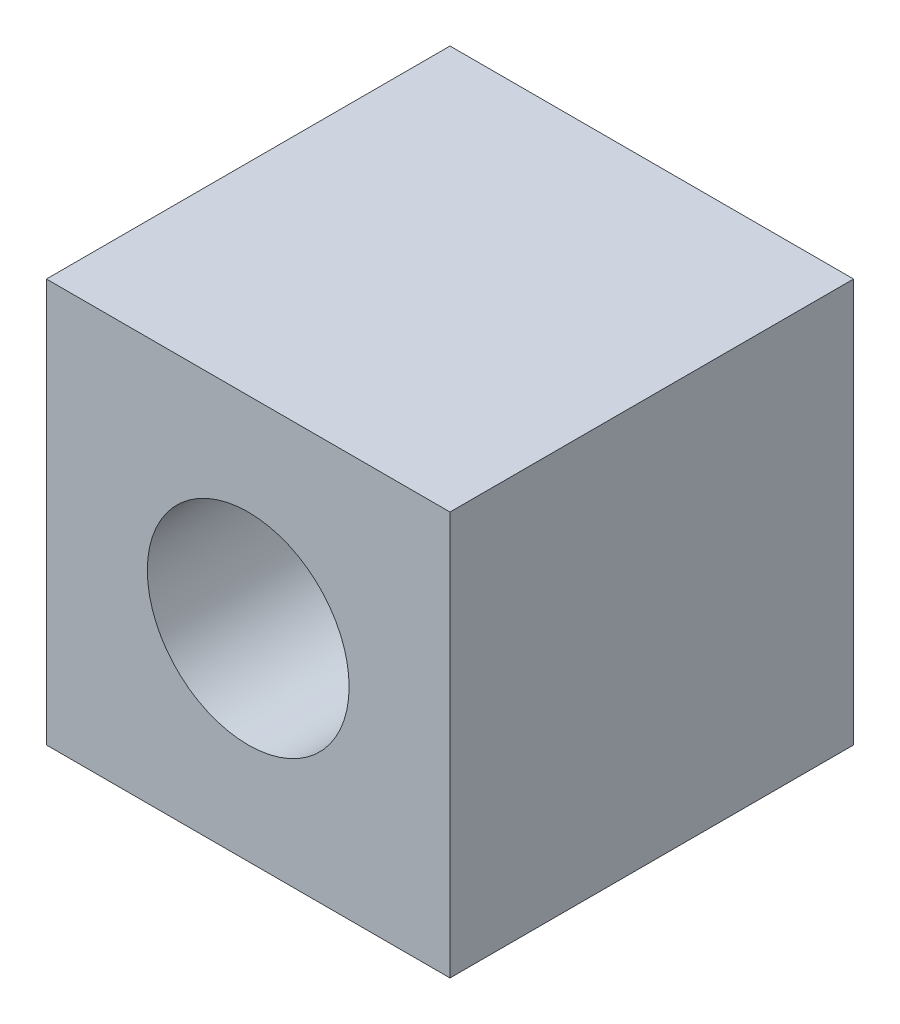
ISO-10303-21;
HEADER;
FILE_DESCRIPTION(('STEP AP214'),'2;1');
FILE_NAME('part.step','',(''),(''),'','','');
FILE_SCHEMA(('AUTOMOTIVE_DESIGN { 1 0 10303 214 1 1 1 1 }'));
ENDSEC;
DATA;
#1=APPLICATION_CONTEXT('core data for automotive mechanical design processes');
#2=APPLICATION_PROTOCOL_DEFINITION('international standard','automotive_design',2000,#1);
#3=PRODUCT_CONTEXT('',#1,'mechanical');
#4=PRODUCT('Part','Part','',(#3));
#5=PRODUCT_RELATED_PRODUCT_CATEGORY('part','',(#4));
#6=PRODUCT_DEFINITION_FORMATION('','',#4);
#7=PRODUCT_DEFINITION_CONTEXT('part definition',#1,'design');
#8=PRODUCT_DEFINITION('design','',#6,#7);
#9=PRODUCT_DEFINITION_SHAPE('','',#8);
#10=(LENGTH_UNIT() NAMED_UNIT(*) SI_UNIT(.MILLI.,.METRE.));
#11=(NAMED_UNIT(*) PLANE_ANGLE_UNIT() SI_UNIT($,.RADIAN.));
#12=(NAMED_UNIT(*) SI_UNIT($,.STERADIAN.) SOLID_ANGLE_UNIT());
#13=UNCERTAINTY_MEASURE_WITH_UNIT(LENGTH_MEASURE(1.E-05),#10,'distance_accuracy_value','');
#14=(GEOMETRIC_REPRESENTATION_CONTEXT(3) GLOBAL_UNCERTAINTY_ASSIGNED_CONTEXT((#13)) GLOBAL_UNIT_ASSIGNED_CONTEXT((#10,
#11,#12)) REPRESENTATION_CONTEXT('',''));
#15=CARTESIAN_POINT('',(0.,0.,0.));
#16=DIRECTION('',(0.,0.,1.));
#17=DIRECTION('',(1.,0.,0.));
#18=AXIS2_PLACEMENT_3D('',#15,#16,#17);
#19=CARTESIAN_POINT('',(0.,0.,10.));
#20=DIRECTION('',(1.,0.,0.));
#21=DIRECTION('',(0.,0.,-1.));
#22=AXIS2_PLACEMENT_3D('',#19,#20,#21);
#23=PLANE('',#22);
#24=DIRECTION('',(0.,-1.,0.));
#25=VECTOR('',#24,1.);
#26=CARTESIAN_POINT('',(0.,0.,0.));
#27=LINE('',#26,#25);
#28=CARTESIAN_POINT('',(0.,10.,0.));
#29=VERTEX_POINT('',#28);
#30=CARTESIAN_POINT('',(0.,0.,0.));
#31=VERTEX_POINT('',#30);
#32=EDGE_CURVE('E97',#29,#31,#27,.T.);
#33=ORIENTED_EDGE('',*,*,#32,.T.);
#34=DIRECTION('',(0.,0.,-1.));
#35=VECTOR('',#34,1.);
#36=CARTESIAN_POINT('',(0.,0.,10.));
#37=LINE('',#36,#35);
#38=CARTESIAN_POINT('',(0.,0.,10.));
#39=VERTEX_POINT('',#38);
#40=EDGE_CURVE('E11',#39,#31,#37,.T.);
#41=ORIENTED_EDGE('',*,*,#40,.F.);
#42=DIRECTION('',(0.,-1.,0.));
#43=VECTOR('',#42,1.);
#44=CARTESIAN_POINT('',(0.,0.,10.));
#45=LINE('',#44,#43);
#46=CARTESIAN_POINT('',(0.,10.,10.));
#47=VERTEX_POINT('',#46);
#48=EDGE_CURVE('E85',#47,#39,#45,.T.);
#49=ORIENTED_EDGE('',*,*,#48,.F.);
#50=DIRECTION('',(0.,0.,-1.));
#51=VECTOR('',#50,1.);
#52=CARTESIAN_POINT('',(0.,10.,10.));
#53=LINE('',#52,#51);
#54=EDGE_CURVE('E93',#47,#29,#53,.T.);
#55=ORIENTED_EDGE('',*,*,#54,.T.);
#56=EDGE_LOOP('',(#33,#41,#49,#55));
#57=FACE_BOUND('',#56,.T.);
#58=ADVANCED_FACE('F34',(#57),#23,.F.);
#59=CARTESIAN_POINT('',(0.,0.,10.));
#60=DIRECTION('',(0.,1.,0.));
#61=DIRECTION('',(0.,0.,1.));
#62=AXIS2_PLACEMENT_3D('',#59,#60,#61);
#63=PLANE('',#62);
#64=DIRECTION('',(1.,0.,0.));
#65=VECTOR('',#64,1.);
#66=CARTESIAN_POINT('',(0.,0.,0.));
#67=LINE('',#66,#65);
#68=CARTESIAN_POINT('',(10.,0.,0.));
#69=VERTEX_POINT('',#68);
#70=EDGE_CURVE('E89',#31,#69,#67,.T.);
#71=ORIENTED_EDGE('',*,*,#70,.T.);
#72=DIRECTION('',(0.,0.,-1.));
#73=VECTOR('',#72,1.);
#74=CARTESIAN_POINT('',(10.,0.,10.));
#75=LINE('',#74,#73);
#76=CARTESIAN_POINT('',(10.,0.,10.));
#77=VERTEX_POINT('',#76);
#78=EDGE_CURVE('E42',#77,#69,#75,.T.);
#79=ORIENTED_EDGE('',*,*,#78,.F.);
#80=DIRECTION('',(1.,0.,0.));
#81=VECTOR('',#80,1.);
#82=CARTESIAN_POINT('',(0.,0.,10.));
#83=LINE('',#82,#81);
#84=EDGE_CURVE('E80',#39,#77,#83,.T.);
#85=ORIENTED_EDGE('',*,*,#84,.F.);
#86=ORIENTED_EDGE('',*,*,#40,.T.);
#87=EDGE_LOOP('',(#71,#79,#85,#86));
#88=FACE_BOUND('',#87,.T.);
#89=ADVANCED_FACE('F88',(#88),#63,.F.);
#90=CARTESIAN_POINT('',(10.,0.,10.));
#91=DIRECTION('',(-1.,0.,0.));
#92=DIRECTION('',(0.,0.,1.));
#93=AXIS2_PLACEMENT_3D('',#90,#91,#92);
#94=PLANE('',#93);
#95=DIRECTION('',(0.,1.,0.));
#96=VECTOR('',#95,1.);
#97=CARTESIAN_POINT('',(10.,0.,0.));
#98=LINE('',#97,#96);
#99=CARTESIAN_POINT('',(10.,10.,0.));
#100=VERTEX_POINT('',#99);
#101=EDGE_CURVE('E67',#69,#100,#98,.T.);
#102=ORIENTED_EDGE('',*,*,#101,.T.);
#103=DIRECTION('',(0.,0.,-1.));
#104=VECTOR('',#103,1.);
#105=CARTESIAN_POINT('',(10.,10.,10.));
#106=LINE('',#105,#104);
#107=CARTESIAN_POINT('',(10.,10.,10.));
#108=VERTEX_POINT('',#107);
#109=EDGE_CURVE('E90',#108,#100,#106,.T.);
#110=ORIENTED_EDGE('',*,*,#109,.F.);
#111=DIRECTION('',(0.,1.,0.));
#112=VECTOR('',#111,1.);
#113=CARTESIAN_POINT('',(10.,0.,10.));
#114=LINE('',#113,#112);
#115=EDGE_CURVE('E83',#77,#108,#114,.T.);
#116=ORIENTED_EDGE('',*,*,#115,.F.);
#117=ORIENTED_EDGE('',*,*,#78,.T.);
#118=EDGE_LOOP('',(#102,#110,#116,#117));
#119=FACE_BOUND('',#118,.T.);
#120=ADVANCED_FACE('F91',(#119),#94,.F.);
#121=CARTESIAN_POINT('',(0.,10.,10.));
#122=DIRECTION('',(0.,-1.,0.));
#123=DIRECTION('',(0.,0.,-1.));
#124=AXIS2_PLACEMENT_3D('',#121,#122,#123);
#125=PLANE('',#124);
#126=DIRECTION('',(-1.,0.,0.));
#127=VECTOR('',#126,1.);
#128=CARTESIAN_POINT('',(0.,10.,0.));
#129=LINE('',#128,#127);
#130=EDGE_CURVE('E73',#100,#29,#129,.T.);
#131=ORIENTED_EDGE('',*,*,#130,.T.);
#132=ORIENTED_EDGE('',*,*,#54,.F.);
#133=DIRECTION('',(-1.,0.,0.));
#134=VECTOR('',#133,1.);
#135=CARTESIAN_POINT('',(0.,10.,10.));
#136=LINE('',#135,#134);
#137=EDGE_CURVE('E50',#108,#47,#136,.T.);
#138=ORIENTED_EDGE('',*,*,#137,.F.);
#139=ORIENTED_EDGE('',*,*,#109,.T.);
#140=EDGE_LOOP('',(#131,#132,#138,#139));
#141=FACE_BOUND('',#140,.T.);
#142=ADVANCED_FACE('F105',(#141),#125,.F.);
#143=CARTESIAN_POINT('',(0.,0.,10.));
#144=DIRECTION('',(0.,0.,-1.));
#145=DIRECTION('',(-1.,0.,0.));
#146=AXIS2_PLACEMENT_3D('',#143,#144,#145);
#147=PLANE('',#146);
#148=CARTESIAN_POINT('',(5.,5.,10.));
#149=DIRECTION('',(0.,0.,1.));
#150=DIRECTION('',(1.,0.,0.));
#151=AXIS2_PLACEMENT_3D('',#148,#149,#150);
#152=CIRCLE('',#151,2.5);
#153=CARTESIAN_POINT('',(7.5,5.,10.));
#154=VERTEX_POINT('',#153);
#155=EDGE_CURVE('E100',#154,#154,#152,.T.);
#156=ORIENTED_EDGE('',*,*,#155,.F.);
#157=EDGE_LOOP('',(#156));
#158=FACE_BOUND('',#157,.T.);
#159=ORIENTED_EDGE('',*,*,#48,.T.);
#160=ORIENTED_EDGE('',*,*,#84,.T.);
#161=ORIENTED_EDGE('',*,*,#115,.T.);
#162=ORIENTED_EDGE('',*,*,#137,.T.);
#163=EDGE_LOOP('',(#159,#160,#161,#162));
#164=FACE_BOUND('',#163,.T.);
#165=ADVANCED_FACE('F81',(#158,#164),#147,.F.);
#166=CARTESIAN_POINT('',(0.,0.,0.));
#167=DIRECTION('',(0.,0.,-1.));
#168=DIRECTION('',(-1.,0.,0.));
#169=AXIS2_PLACEMENT_3D('',#166,#167,#168);
#170=PLANE('',#169);
#171=CARTESIAN_POINT('',(5.,5.,0.));
#172=DIRECTION('',(0.,0.,1.));
#173=DIRECTION('',(1.,0.,0.));
#174=AXIS2_PLACEMENT_3D('',#171,#172,#173);
#175=CIRCLE('',#174,2.5);
#176=CARTESIAN_POINT('',(7.5,5.,0.));
#177=VERTEX_POINT('',#176);
#178=EDGE_CURVE('E111',#177,#177,#175,.T.);
#179=ORIENTED_EDGE('',*,*,#178,.T.);
#180=EDGE_LOOP('',(#179));
#181=FACE_BOUND('',#180,.T.);
#182=ORIENTED_EDGE('',*,*,#32,.F.);
#183=ORIENTED_EDGE('',*,*,#130,.F.);
#184=ORIENTED_EDGE('',*,*,#101,.F.);
#185=ORIENTED_EDGE('',*,*,#70,.F.);
#186=EDGE_LOOP('',(#182,#183,#184,#185));
#187=FACE_BOUND('',#186,.T.);
#188=ADVANCED_FACE('F108',(#181,#187),#170,.T.);
#189=CARTESIAN_POINT('',(5.,5.,10.));
#190=DIRECTION('',(0.,0.,-1.));
#191=DIRECTION('',(-1.,0.,0.));
#192=AXIS2_PLACEMENT_3D('',#189,#190,#191);
#193=CYLINDRICAL_SURFACE('',#192,2.5);
#194=ORIENTED_EDGE('',*,*,#155,.T.);
#195=EDGE_LOOP('',(#194));
#196=FACE_BOUND('',#195,.T.);
#197=ORIENTED_EDGE('',*,*,#178,.F.);
#198=EDGE_LOOP('',(#197));
#199=FACE_BOUND('',#198,.T.);
#200=ADVANCED_FACE('F117',(#196,#199),#193,.F.);
#201=CLOSED_SHELL('',(#58,#89,#120,#142,#165,#188,#200));
#202=MANIFOLD_SOLID_BREP('B2',#201);
#203=ADVANCED_BREP_SHAPE_REPRESENTATION('',(#18,#202),#14);
#204=SHAPE_DEFINITION_REPRESENTATION(#9,#203);
ENDSEC;
END-ISO-10303-21;
